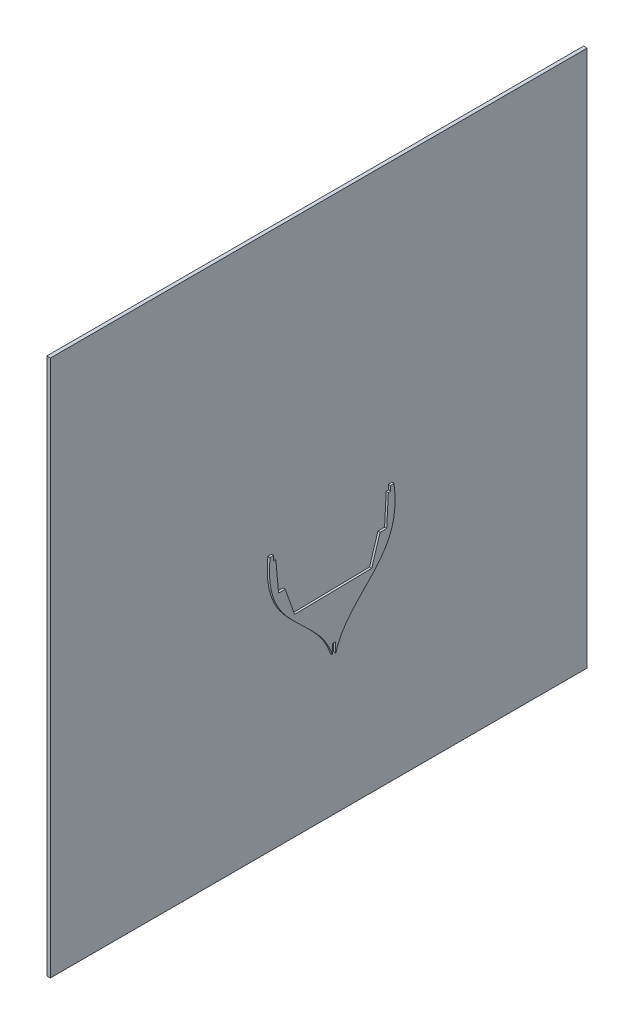
ISO-10303-21;
HEADER;
FILE_DESCRIPTION(('STEP AP214'),'2;1');
FILE_NAME('part.step','',(''),(''),'','','');
FILE_SCHEMA(('AUTOMOTIVE_DESIGN { 1 0 10303 214 1 1 1 1 }'));
ENDSEC;
DATA;
#1=APPLICATION_CONTEXT('core data for automotive mechanical design processes');
#2=APPLICATION_PROTOCOL_DEFINITION('international standard','automotive_design',2000,#1);
#3=PRODUCT_CONTEXT('',#1,'mechanical');
#4=PRODUCT('Part','Part','',(#3));
#5=PRODUCT_RELATED_PRODUCT_CATEGORY('part','',(#4));
#6=PRODUCT_DEFINITION_FORMATION('','',#4);
#7=PRODUCT_DEFINITION_CONTEXT('part definition',#1,'design');
#8=PRODUCT_DEFINITION('design','',#6,#7);
#9=PRODUCT_DEFINITION_SHAPE('','',#8);
#10=(LENGTH_UNIT() NAMED_UNIT(*) SI_UNIT(.MILLI.,.METRE.));
#11=(NAMED_UNIT(*) PLANE_ANGLE_UNIT() SI_UNIT($,.RADIAN.));
#12=(NAMED_UNIT(*) SI_UNIT($,.STERADIAN.) SOLID_ANGLE_UNIT());
#13=UNCERTAINTY_MEASURE_WITH_UNIT(LENGTH_MEASURE(1.E-05),#10,'distance_accuracy_value','');
#14=(GEOMETRIC_REPRESENTATION_CONTEXT(3) GLOBAL_UNCERTAINTY_ASSIGNED_CONTEXT((#13)) GLOBAL_UNIT_ASSIGNED_CONTEXT((#10,
#11,#12)) REPRESENTATION_CONTEXT('',''));
#15=CARTESIAN_POINT('',(0.,0.,0.));
#16=DIRECTION('',(0.,0.,1.));
#17=DIRECTION('',(1.,0.,0.));
#18=AXIS2_PLACEMENT_3D('',#15,#16,#17);
#19=CARTESIAN_POINT('',(6.,347.676833701413,179.565943675881));
#20=CARTESIAN_POINT('',(6.,132.75725474235,200.919075611293));
#21=CARTESIAN_POINT('',(6.,163.447551844755,30.0334903217819));
#22=CARTESIAN_POINT('',(6.,24.8349411051071,0.449894327244288));
#23=CARTESIAN_POINT('',(6.,0.,0.));
#24=B_SPLINE_CURVE_WITH_KNOTS('',4,(#19,#20,#21,#22,#23),.UNSPECIFIED.,.F.,.F.,(5,5),(0.,1.),.UNSPECIFIED.);
#25=DIRECTION('',(-1.,0.,0.));
#26=VECTOR('',#25,1.);
#27=SURFACE_OF_LINEAR_EXTRUSION('',#24,#26);
#28=CARTESIAN_POINT('',(0.,347.676833701413,179.565943675881));
#29=CARTESIAN_POINT('',(0.,132.75725474235,200.919075611293));
#30=CARTESIAN_POINT('',(0.,163.447551844755,30.0334903217819));
#31=CARTESIAN_POINT('',(0.,24.8349411051071,0.449894327244288));
#32=CARTESIAN_POINT('',(0.,0.,0.));
#33=B_SPLINE_CURVE_WITH_KNOTS('',4,(#28,#29,#30,#31,#32),.UNSPECIFIED.,.F.,.F.,(5,5),(0.,1.),.UNSPECIFIED.);
#34=CARTESIAN_POINT('',(0.,347.676833701413,179.565943675881));
#35=VERTEX_POINT('',#34);
#36=CARTESIAN_POINT('',(0.,25.1444972537399,4.95697880467764));
#37=VERTEX_POINT('',#36);
#38=EDGE_CURVE('E191',#35,#37,#33,.T.);
#39=ORIENTED_EDGE('',*,*,#38,.T.);
#40=DIRECTION('',(1.,0.,0.));
#41=VECTOR('',#40,1.);
#42=CARTESIAN_POINT('',(0.,25.1444972537399,4.95697880467764));
#43=LINE('',#42,#41);
#44=CARTESIAN_POINT('',(6.,25.1444972537399,4.95697880467764));
#45=VERTEX_POINT('',#44);
#46=EDGE_CURVE('E197',#37,#45,#43,.T.);
#47=ORIENTED_EDGE('',*,*,#46,.T.);
#48=CARTESIAN_POINT('',(6.,347.676833701413,179.565943675881));
#49=VERTEX_POINT('',#48);
#50=EDGE_CURVE('E231',#49,#45,#24,.T.);
#51=ORIENTED_EDGE('',*,*,#50,.F.);
#52=DIRECTION('',(-1.,0.,0.));
#53=VECTOR('',#52,1.);
#54=CARTESIAN_POINT('',(6.,347.676833701413,179.565943675881));
#55=LINE('',#54,#53);
#56=EDGE_CURVE('E187',#49,#35,#55,.T.);
#57=ORIENTED_EDGE('',*,*,#56,.T.);
#58=EDGE_LOOP('',(#39,#47,#51,#57));
#59=FACE_BOUND('',#58,.T.);
#60=ADVANCED_FACE('F45',(#59),#27,.F.);
#61=CARTESIAN_POINT('',(6.,0.,0.));
#62=CARTESIAN_POINT('',(6.,24.8349411051071,0.449894327244202));
#63=CARTESIAN_POINT('',(6.,164.428089929039,-24.0938993780662));
#64=CARTESIAN_POINT('',(6.,139.947211869968,-195.978931319273));
#65=CARTESIAN_POINT('',(6.,353.952391842304,-166.855665561471));
#66=B_SPLINE_CURVE_WITH_KNOTS('',4,(#61,#62,#63,#64,#65),.UNSPECIFIED.,.F.,.F.,(5,5),(0.,1.),.UNSPECIFIED.);
#67=DIRECTION('',(-1.,0.,0.));
#68=VECTOR('',#67,1.);
#69=SURFACE_OF_LINEAR_EXTRUSION('',#66,#68);
#70=CARTESIAN_POINT('',(6.,25.307535649042,-4.04302119532236));
#71=VERTEX_POINT('',#70);
#72=CARTESIAN_POINT('',(6.,353.952391842304,-166.855665561471));
#73=VERTEX_POINT('',#72);
#74=EDGE_CURVE('E128',#71,#73,#66,.T.);
#75=ORIENTED_EDGE('',*,*,#74,.F.);
#76=DIRECTION('',(1.,0.,0.));
#77=VECTOR('',#76,1.);
#78=CARTESIAN_POINT('',(0.,25.307535649042,-4.04302119532236));
#79=LINE('',#78,#77);
#80=CARTESIAN_POINT('',(0.,25.307535649042,-4.04302119532236));
#81=VERTEX_POINT('',#80);
#82=EDGE_CURVE('E323',#81,#71,#79,.T.);
#83=ORIENTED_EDGE('',*,*,#82,.F.);
#84=CARTESIAN_POINT('',(0.,0.,0.));
#85=CARTESIAN_POINT('',(0.,24.8349411051071,0.449894327244202));
#86=CARTESIAN_POINT('',(0.,164.428089929039,-24.0938993780662));
#87=CARTESIAN_POINT('',(0.,139.947211869968,-195.978931319273));
#88=CARTESIAN_POINT('',(0.,353.952391842304,-166.855665561471));
#89=B_SPLINE_CURVE_WITH_KNOTS('',4,(#84,#85,#86,#87,#88),.UNSPECIFIED.,.F.,.F.,(5,5),(0.,1.),.UNSPECIFIED.);
#90=CARTESIAN_POINT('',(0.,353.952391842304,-166.855665561471));
#91=VERTEX_POINT('',#90);
#92=EDGE_CURVE('E196',#81,#91,#89,.T.);
#93=ORIENTED_EDGE('',*,*,#92,.T.);
#94=DIRECTION('',(-1.,0.,0.));
#95=VECTOR('',#94,1.);
#96=CARTESIAN_POINT('',(6.,353.952391842304,-166.855665561471));
#97=LINE('',#96,#95);
#98=EDGE_CURVE('E13',#73,#91,#97,.T.);
#99=ORIENTED_EDGE('',*,*,#98,.F.);
#100=EDGE_LOOP('',(#75,#83,#93,#99));
#101=FACE_BOUND('',#100,.T.);
#102=ADVANCED_FACE('F335',(#101),#69,.F.);
#103=CARTESIAN_POINT('',(6.,353.952391842304,-166.855665561471));
#104=DIRECTION('',(0.,-0.999835956927465,-0.0181124055536444));
#105=DIRECTION('',(0.,0.0181124055536444,-0.999835956927465));
#106=AXIS2_PLACEMENT_3D('',#103,#104,#105);
#107=PLANE('',#106);
#108=DIRECTION('',(0.,-0.0181124055536444,0.999835956927465));
#109=VECTOR('',#108,1.);
#110=CARTESIAN_POINT('',(0.,353.952391842304,-166.855665561471));
#111=LINE('',#110,#109);
#112=CARTESIAN_POINT('',(0.,353.771238069747,-156.855665561471));
#113=VERTEX_POINT('',#112);
#114=EDGE_CURVE('E204',#91,#113,#111,.T.);
#115=ORIENTED_EDGE('',*,*,#114,.T.);
#116=DIRECTION('',(-1.,0.,0.));
#117=VECTOR('',#116,1.);
#118=CARTESIAN_POINT('',(6.,353.771238069747,-156.855665561471));
#119=LINE('',#118,#117);
#120=CARTESIAN_POINT('',(6.,353.771238069747,-156.855665561471));
#121=VERTEX_POINT('',#120);
#122=EDGE_CURVE('E53',#121,#113,#119,.T.);
#123=ORIENTED_EDGE('',*,*,#122,.F.);
#124=DIRECTION('',(0.,-0.0181124055536444,0.999835956927465));
#125=VECTOR('',#124,1.);
#126=CARTESIAN_POINT('',(6.,353.952391842304,-166.855665561471));
#127=LINE('',#126,#125);
#128=EDGE_CURVE('E317',#73,#121,#127,.T.);
#129=ORIENTED_EDGE('',*,*,#128,.F.);
#130=ORIENTED_EDGE('',*,*,#98,.T.);
#131=EDGE_LOOP('',(#115,#123,#129,#130));
#132=FACE_BOUND('',#131,.T.);
#133=ADVANCED_FACE('F338',(#132),#107,.F.);
#134=CARTESIAN_POINT('',(6.,353.771238069747,-156.855665561471));
#135=DIRECTION('',(0.,0.0615422827320698,-0.998104477214748));
#136=DIRECTION('',(0.,0.998104477214748,0.0615422827320698));
#137=AXIS2_PLACEMENT_3D('',#134,#135,#136);
#138=PLANE('',#137);
#139=DIRECTION('',(0.,-0.998104477214748,-0.0615422827320698));
#140=VECTOR('',#139,1.);
#141=CARTESIAN_POINT('',(0.,353.771238069747,-156.855665561471));
#142=LINE('',#141,#140);
#143=CARTESIAN_POINT('',(0.,339.701693596399,-157.723181842238));
#144=VERTEX_POINT('',#143);
#145=EDGE_CURVE('E209',#113,#144,#142,.T.);
#146=ORIENTED_EDGE('',*,*,#145,.T.);
#147=DIRECTION('',(-1.,0.,0.));
#148=VECTOR('',#147,1.);
#149=CARTESIAN_POINT('',(6.,339.701693596399,-157.723181842238));
#150=LINE('',#149,#148);
#151=CARTESIAN_POINT('',(6.,339.701693596399,-157.723181842238));
#152=VERTEX_POINT('',#151);
#153=EDGE_CURVE('E256',#152,#144,#150,.T.);
#154=ORIENTED_EDGE('',*,*,#153,.F.);
#155=DIRECTION('',(0.,-0.998104477214748,-0.0615422827320698));
#156=VECTOR('',#155,1.);
#157=CARTESIAN_POINT('',(6.,353.771238069747,-156.855665561471));
#158=LINE('',#157,#156);
#159=EDGE_CURVE('E265',#121,#152,#158,.T.);
#160=ORIENTED_EDGE('',*,*,#159,.F.);
#161=ORIENTED_EDGE('',*,*,#122,.T.);
#162=EDGE_LOOP('',(#146,#154,#160,#161));
#163=FACE_BOUND('',#162,.T.);
#164=ADVANCED_FACE('F263',(#163),#138,.F.);
#165=CARTESIAN_POINT('',(6.,339.701693596399,-157.723181842238));
#166=DIRECTION('',(0.,-0.999835956927465,-0.0181124055536607));
#167=DIRECTION('',(0.,0.0181124055536607,-0.999835956927465));
#168=AXIS2_PLACEMENT_3D('',#165,#166,#167);
#169=PLANE('',#168);
#170=DIRECTION('',(0.,-0.0181124055536607,0.999835956927465));
#171=VECTOR('',#170,1.);
#172=CARTESIAN_POINT('',(0.,339.701693596399,-157.723181842238));
#173=LINE('',#172,#171);
#174=CARTESIAN_POINT('',(0.,339.580236130428,-151.018520699586));
#175=VERTEX_POINT('',#174);
#176=EDGE_CURVE('E211',#144,#175,#173,.T.);
#177=ORIENTED_EDGE('',*,*,#176,.T.);
#178=DIRECTION('',(-1.,0.,0.));
#179=VECTOR('',#178,1.);
#180=CARTESIAN_POINT('',(6.,339.580236130428,-151.018520699586));
#181=LINE('',#180,#179);
#182=CARTESIAN_POINT('',(6.,339.580236130428,-151.018520699586));
#183=VERTEX_POINT('',#182);
#184=EDGE_CURVE('E253',#183,#175,#181,.T.);
#185=ORIENTED_EDGE('',*,*,#184,.F.);
#186=DIRECTION('',(0.,-0.0181124055536607,0.999835956927465));
#187=VECTOR('',#186,1.);
#188=CARTESIAN_POINT('',(6.,339.701693596399,-157.723181842238));
#189=LINE('',#188,#187);
#190=EDGE_CURVE('E287',#152,#183,#189,.T.);
#191=ORIENTED_EDGE('',*,*,#190,.F.);
#192=ORIENTED_EDGE('',*,*,#153,.T.);
#193=EDGE_LOOP('',(#177,#185,#191,#192));
#194=FACE_BOUND('',#193,.T.);
#195=ADVANCED_FACE('F278',(#194),#169,.F.);
#196=CARTESIAN_POINT('',(6.,339.580236130428,-151.018520699586));
#197=DIRECTION('',(0.,-0.0538390916893999,-0.998549624308207));
#198=DIRECTION('',(0.,0.998549624308207,-0.0538390916893999));
#199=AXIS2_PLACEMENT_3D('',#196,#197,#198);
#200=PLANE('',#199);
#201=DIRECTION('',(0.,-0.998549624308206,0.0538390916893999));
#202=VECTOR('',#201,1.);
#203=CARTESIAN_POINT('',(0.,339.580236130428,-151.018520699586));
#204=LINE('',#203,#202);
#205=CARTESIAN_POINT('',(0.,255.274664597182,-146.47299258039));
#206=VERTEX_POINT('',#205);
#207=EDGE_CURVE('E213',#175,#206,#204,.T.);
#208=ORIENTED_EDGE('',*,*,#207,.T.);
#209=DIRECTION('',(-1.,0.,0.));
#210=VECTOR('',#209,1.);
#211=CARTESIAN_POINT('',(6.,255.274664597182,-146.47299258039));
#212=LINE('',#211,#210);
#213=CARTESIAN_POINT('',(6.,255.274664597182,-146.47299258039));
#214=VERTEX_POINT('',#213);
#215=EDGE_CURVE('E250',#214,#206,#212,.T.);
#216=ORIENTED_EDGE('',*,*,#215,.F.);
#217=DIRECTION('',(0.,-0.998549624308206,0.0538390916893999));
#218=VECTOR('',#217,1.);
#219=CARTESIAN_POINT('',(6.,339.580236130428,-151.018520699586));
#220=LINE('',#219,#218);
#221=EDGE_CURVE('E284',#183,#214,#220,.T.);
#222=ORIENTED_EDGE('',*,*,#221,.F.);
#223=ORIENTED_EDGE('',*,*,#184,.T.);
#224=EDGE_LOOP('',(#208,#216,#222,#223));
#225=FACE_BOUND('',#224,.T.);
#226=ADVANCED_FACE('F282',(#225),#200,.F.);
#227=CARTESIAN_POINT('',(6.,255.274664597182,-146.47299258039));
#228=DIRECTION('',(0.,-0.999835956927465,-0.0181124055536453));
#229=DIRECTION('',(0.,0.0181124055536453,-0.999835956927465));
#230=AXIS2_PLACEMENT_3D('',#227,#228,#229);
#231=PLANE('',#230);
#232=DIRECTION('',(0.,-0.0181124055536454,0.999835956927465));
#233=VECTOR('',#232,1.);
#234=CARTESIAN_POINT('',(0.,255.274664597182,-146.47299258039));
#235=LINE('',#234,#233);
#236=CARTESIAN_POINT('',(0.,254.939924048743,-127.994738238122));
#237=VERTEX_POINT('',#236);
#238=EDGE_CURVE('E215',#206,#237,#235,.T.);
#239=ORIENTED_EDGE('',*,*,#238,.T.);
#240=DIRECTION('',(-1.,0.,0.));
#241=VECTOR('',#240,1.);
#242=CARTESIAN_POINT('',(6.,254.939924048743,-127.994738238122));
#243=LINE('',#242,#241);
#244=CARTESIAN_POINT('',(6.,254.939924048743,-127.994738238122));
#245=VERTEX_POINT('',#244);
#246=EDGE_CURVE('E247',#245,#237,#243,.T.);
#247=ORIENTED_EDGE('',*,*,#246,.F.);
#248=DIRECTION('',(0.,-0.0181124055536454,0.999835956927465));
#249=VECTOR('',#248,1.);
#250=CARTESIAN_POINT('',(6.,255.274664597182,-146.47299258039));
#251=LINE('',#250,#249);
#252=EDGE_CURVE('E286',#214,#245,#251,.T.);
#253=ORIENTED_EDGE('',*,*,#252,.F.);
#254=ORIENTED_EDGE('',*,*,#215,.T.);
#255=EDGE_LOOP('',(#239,#247,#253,#254));
#256=FACE_BOUND('',#255,.T.);
#257=ADVANCED_FACE('F348',(#256),#231,.F.);
#258=CARTESIAN_POINT('',(6.,254.939924048743,-127.994738238122));
#259=DIRECTION('',(0.,-0.299079840367612,-0.954228090702471));
#260=DIRECTION('',(0.,0.954228090702471,-0.299079840367612));
#261=AXIS2_PLACEMENT_3D('',#258,#259,#260);
#262=PLANE('',#261);
#263=DIRECTION('',(0.,-0.954228090702471,0.299079840367612));
#264=VECTOR('',#263,1.);
#265=CARTESIAN_POINT('',(0.,254.939924048743,-127.994738238122));
#266=LINE('',#265,#264);
#267=CARTESIAN_POINT('',(0.,179.749987818233,-104.428261476243));
#268=VERTEX_POINT('',#267);
#269=EDGE_CURVE('E217',#237,#268,#266,.T.);
#270=ORIENTED_EDGE('',*,*,#269,.T.);
#271=DIRECTION('',(-1.,0.,0.));
#272=VECTOR('',#271,1.);
#273=CARTESIAN_POINT('',(6.,179.749987818233,-104.428261476243));
#274=LINE('',#273,#272);
#275=CARTESIAN_POINT('',(6.,179.749987818233,-104.428261476243));
#276=VERTEX_POINT('',#275);
#277=EDGE_CURVE('E244',#276,#268,#274,.T.);
#278=ORIENTED_EDGE('',*,*,#277,.F.);
#279=DIRECTION('',(0.,-0.954228090702471,0.299079840367612));
#280=VECTOR('',#279,1.);
#281=CARTESIAN_POINT('',(6.,254.939924048743,-127.994738238122));
#282=LINE('',#281,#280);
#283=EDGE_CURVE('E289',#245,#276,#282,.T.);
#284=ORIENTED_EDGE('',*,*,#283,.F.);
#285=ORIENTED_EDGE('',*,*,#246,.T.);
#286=EDGE_LOOP('',(#270,#278,#284,#285));
#287=FACE_BOUND('',#286,.T.);
#288=ADVANCED_FACE('F351',(#287),#262,.F.);
#289=CARTESIAN_POINT('',(6.,179.749987818233,-104.428261476243));
#290=DIRECTION('',(0.,-0.999835956927465,-0.0181124055536428));
#291=DIRECTION('',(0.,0.0181124055536428,-0.999835956927466));
#292=AXIS2_PLACEMENT_3D('',#289,#290,#291);
#293=PLANE('',#292);
#294=DIRECTION('',(0.,-0.0181124055536428,0.999835956927465));
#295=VECTOR('',#294,1.);
#296=CARTESIAN_POINT('',(0.,179.749987818233,-104.428261476243));
#297=LINE('',#296,#295);
#298=CARTESIAN_POINT('',(0.,175.849777042588,110.870085368766));
#299=VERTEX_POINT('',#298);
#300=EDGE_CURVE('E219',#268,#299,#297,.T.);
#301=ORIENTED_EDGE('',*,*,#300,.T.);
#302=DIRECTION('',(-1.,0.,0.));
#303=VECTOR('',#302,1.);
#304=CARTESIAN_POINT('',(6.,175.849777042588,110.870085368766));
#305=LINE('',#304,#303);
#306=CARTESIAN_POINT('',(6.,175.849777042588,110.870085368766));
#307=VERTEX_POINT('',#306);
#308=EDGE_CURVE('E241',#307,#299,#305,.T.);
#309=ORIENTED_EDGE('',*,*,#308,.F.);
#310=DIRECTION('',(0.,-0.0181124055536428,0.999835956927465));
#311=VECTOR('',#310,1.);
#312=CARTESIAN_POINT('',(6.,179.749987818233,-104.428261476243));
#313=LINE('',#312,#311);
#314=EDGE_CURVE('E295',#276,#307,#313,.T.);
#315=ORIENTED_EDGE('',*,*,#314,.F.);
#316=ORIENTED_EDGE('',*,*,#277,.T.);
#317=EDGE_LOOP('',(#301,#309,#315,#316));
#318=FACE_BOUND('',#317,.T.);
#319=ADVANCED_FACE('F355',(#318),#293,.F.);
#320=CARTESIAN_POINT('',(6.,250.136828640148,137.14439415621));
#321=DIRECTION('',(0.,-0.333444670466363,0.94276967056518));
#322=DIRECTION('',(0.,-0.94276967056518,-0.333444670466363));
#323=AXIS2_PLACEMENT_3D('',#320,#321,#322);
#324=PLANE('',#323);
#325=DIRECTION('',(0.,0.94276967056518,0.333444670466363));
#326=VECTOR('',#325,1.);
#327=CARTESIAN_POINT('',(0.,250.136828640148,137.14439415621));
#328=LINE('',#327,#326);
#329=CARTESIAN_POINT('',(0.,250.136828640148,137.14439415621));
#330=VERTEX_POINT('',#329);
#331=EDGE_CURVE('E221',#299,#330,#328,.T.);
#332=ORIENTED_EDGE('',*,*,#331,.T.);
#333=DIRECTION('',(-1.,0.,0.));
#334=VECTOR('',#333,1.);
#335=CARTESIAN_POINT('',(6.,250.136828640148,137.14439415621));
#336=LINE('',#335,#334);
#337=CARTESIAN_POINT('',(6.,250.136828640148,137.14439415621));
#338=VERTEX_POINT('',#337);
#339=EDGE_CURVE('E238',#338,#330,#336,.T.);
#340=ORIENTED_EDGE('',*,*,#339,.F.);
#341=DIRECTION('',(0.,0.94276967056518,0.333444670466363));
#342=VECTOR('',#341,1.);
#343=CARTESIAN_POINT('',(6.,250.136828640148,137.14439415621));
#344=LINE('',#343,#342);
#345=EDGE_CURVE('E297',#307,#338,#344,.T.);
#346=ORIENTED_EDGE('',*,*,#345,.F.);
#347=ORIENTED_EDGE('',*,*,#308,.T.);
#348=EDGE_LOOP('',(#332,#340,#346,#347));
#349=FACE_BOUND('',#348,.T.);
#350=ADVANCED_FACE('F359',(#349),#324,.F.);
#351=CARTESIAN_POINT('',(6.,249.802088091709,155.622648498477));
#352=DIRECTION('',(0.,-0.999835956927465,-0.0181124055536441));
#353=DIRECTION('',(0.,0.0181124055536441,-0.999835956927465));
#354=AXIS2_PLACEMENT_3D('',#351,#352,#353);
#355=PLANE('',#354);
#356=DIRECTION('',(0.,-0.0181124055536441,0.999835956927465));
#357=VECTOR('',#356,1.);
#358=CARTESIAN_POINT('',(0.,249.802088091709,155.622648498477));
#359=LINE('',#358,#357);
#360=CARTESIAN_POINT('',(0.,249.802088091709,155.622648498477));
#361=VERTEX_POINT('',#360);
#362=EDGE_CURVE('E223',#330,#361,#359,.T.);
#363=ORIENTED_EDGE('',*,*,#362,.T.);
#364=DIRECTION('',(-1.,0.,0.));
#365=VECTOR('',#364,1.);
#366=CARTESIAN_POINT('',(6.,249.802088091709,155.622648498477));
#367=LINE('',#366,#365);
#368=CARTESIAN_POINT('',(6.,249.802088091709,155.622648498477));
#369=VERTEX_POINT('',#368);
#370=EDGE_CURVE('E235',#369,#361,#367,.T.);
#371=ORIENTED_EDGE('',*,*,#370,.F.);
#372=DIRECTION('',(0.,-0.0181124055536441,0.999835956927465));
#373=VECTOR('',#372,1.);
#374=CARTESIAN_POINT('',(6.,249.802088091709,155.622648498477));
#375=LINE('',#374,#373);
#376=EDGE_CURVE('E299',#338,#369,#375,.T.);
#377=ORIENTED_EDGE('',*,*,#376,.F.);
#378=ORIENTED_EDGE('',*,*,#339,.T.);
#379=EDGE_LOOP('',(#363,#371,#377,#378));
#380=FACE_BOUND('',#379,.T.);
#381=ADVANCED_FACE('F305',(#380),#355,.F.);
#382=CARTESIAN_POINT('',(6.,333.887711296337,163.218646636903));
#383=DIRECTION('',(0.,-0.0899701045781973,0.995944466464967));
#384=DIRECTION('',(0.,-0.995944466464967,-0.0899701045781973));
#385=AXIS2_PLACEMENT_3D('',#382,#383,#384);
#386=PLANE('',#385);
#387=DIRECTION('',(0.,0.995944466464967,0.0899701045781973));
#388=VECTOR('',#387,1.);
#389=CARTESIAN_POINT('',(0.,333.887711296337,163.218646636903));
#390=LINE('',#389,#388);
#391=CARTESIAN_POINT('',(0.,333.887711296337,163.218646636903));
#392=VERTEX_POINT('',#391);
#393=EDGE_CURVE('E225',#361,#392,#390,.T.);
#394=ORIENTED_EDGE('',*,*,#393,.T.);
#395=DIRECTION('',(-1.,0.,0.));
#396=VECTOR('',#395,1.);
#397=CARTESIAN_POINT('',(6.,333.887711296337,163.218646636903));
#398=LINE('',#397,#396);
#399=CARTESIAN_POINT('',(6.,333.887711296337,163.218646636903));
#400=VERTEX_POINT('',#399);
#401=EDGE_CURVE('E182',#400,#392,#398,.T.);
#402=ORIENTED_EDGE('',*,*,#401,.F.);
#403=DIRECTION('',(0.,0.995944466464967,0.0899701045781973));
#404=VECTOR('',#403,1.);
#405=CARTESIAN_POINT('',(6.,333.887711296337,163.218646636903));
#406=LINE('',#405,#404);
#407=EDGE_CURVE('E170',#369,#400,#406,.T.);
#408=ORIENTED_EDGE('',*,*,#407,.F.);
#409=ORIENTED_EDGE('',*,*,#370,.T.);
#410=EDGE_LOOP('',(#394,#402,#408,#409));
#411=FACE_BOUND('',#410,.T.);
#412=ADVANCED_FACE('F309',(#411),#386,.F.);
#413=CARTESIAN_POINT('',(6.,333.766253830366,169.923307779555));
#414=DIRECTION('',(0.,-0.999835956927465,-0.0181124055536439));
#415=DIRECTION('',(0.,0.0181124055536439,-0.999835956927466));
#416=AXIS2_PLACEMENT_3D('',#413,#414,#415);
#417=PLANE('',#416);
#418=DIRECTION('',(0.,-0.0181124055536439,0.999835956927465));
#419=VECTOR('',#418,1.);
#420=CARTESIAN_POINT('',(0.,333.766253830366,169.923307779555));
#421=LINE('',#420,#419);
#422=CARTESIAN_POINT('',(0.,333.766253830366,169.923307779555));
#423=VERTEX_POINT('',#422);
#424=EDGE_CURVE('E179',#392,#423,#421,.T.);
#425=ORIENTED_EDGE('',*,*,#424,.T.);
#426=DIRECTION('',(-1.,0.,0.));
#427=VECTOR('',#426,1.);
#428=CARTESIAN_POINT('',(6.,333.766253830366,169.923307779555));
#429=LINE('',#428,#427);
#430=CARTESIAN_POINT('',(6.,333.766253830366,169.923307779555));
#431=VERTEX_POINT('',#430);
#432=EDGE_CURVE('E176',#431,#423,#429,.T.);
#433=ORIENTED_EDGE('',*,*,#432,.F.);
#434=DIRECTION('',(0.,-0.0181124055536439,0.999835956927465));
#435=VECTOR('',#434,1.);
#436=CARTESIAN_POINT('',(6.,333.766253830366,169.923307779555));
#437=LINE('',#436,#435);
#438=EDGE_CURVE('E163',#400,#431,#437,.T.);
#439=ORIENTED_EDGE('',*,*,#438,.F.);
#440=ORIENTED_EDGE('',*,*,#401,.T.);
#441=EDGE_LOOP('',(#425,#433,#439,#440));
#442=FACE_BOUND('',#441,.T.);
#443=ADVANCED_FACE('F177',(#442),#417,.F.);
#444=CARTESIAN_POINT('',(6.,347.857987473971,169.565943675881));
#445=DIRECTION('',(0.,0.0253516887165552,0.999678594288794));
#446=DIRECTION('',(0.,-0.999678594288794,0.0253516887165552));
#447=AXIS2_PLACEMENT_3D('',#444,#445,#446);
#448=PLANE('',#447);
#449=DIRECTION('',(0.,0.999678594288794,-0.0253516887165552));
#450=VECTOR('',#449,1.);
#451=CARTESIAN_POINT('',(0.,347.857987473971,169.565943675881));
#452=LINE('',#451,#450);
#453=CARTESIAN_POINT('',(0.,347.857987473971,169.565943675881));
#454=VERTEX_POINT('',#453);
#455=EDGE_CURVE('E228',#423,#454,#452,.T.);
#456=ORIENTED_EDGE('',*,*,#455,.T.);
#457=DIRECTION('',(-1.,0.,0.));
#458=VECTOR('',#457,1.);
#459=CARTESIAN_POINT('',(6.,347.857987473971,169.565943675881));
#460=LINE('',#459,#458);
#461=CARTESIAN_POINT('',(6.,347.857987473971,169.565943675881));
#462=VERTEX_POINT('',#461);
#463=EDGE_CURVE('E183',#462,#454,#460,.T.);
#464=ORIENTED_EDGE('',*,*,#463,.F.);
#465=DIRECTION('',(0.,0.999678594288794,-0.0253516887165552));
#466=VECTOR('',#465,1.);
#467=CARTESIAN_POINT('',(6.,347.857987473971,169.565943675881));
#468=LINE('',#467,#466);
#469=EDGE_CURVE('E167',#431,#462,#468,.T.);
#470=ORIENTED_EDGE('',*,*,#469,.F.);
#471=ORIENTED_EDGE('',*,*,#432,.T.);
#472=EDGE_LOOP('',(#456,#464,#470,#471));
#473=FACE_BOUND('',#472,.T.);
#474=ADVANCED_FACE('F185',(#473),#448,.F.);
#475=CARTESIAN_POINT('',(6.,347.676833701413,179.565943675881));
#476=DIRECTION('',(0.,-0.999835956927465,-0.0181124055536503));
#477=DIRECTION('',(0.,0.0181124055536503,-0.999835956927465));
#478=AXIS2_PLACEMENT_3D('',#475,#476,#477);
#479=PLANE('',#478);
#480=DIRECTION('',(0.,-0.0181124055536503,0.999835956927465));
#481=VECTOR('',#480,1.);
#482=CARTESIAN_POINT('',(0.,347.676833701413,179.565943675881));
#483=LINE('',#482,#481);
#484=EDGE_CURVE('E120',#454,#35,#483,.T.);
#485=ORIENTED_EDGE('',*,*,#484,.T.);
#486=ORIENTED_EDGE('',*,*,#56,.F.);
#487=DIRECTION('',(0.,-0.0181124055536503,0.999835956927465));
#488=VECTOR('',#487,1.);
#489=CARTESIAN_POINT('',(6.,347.676833701413,179.565943675881));
#490=LINE('',#489,#488);
#491=EDGE_CURVE('E69',#462,#49,#490,.T.);
#492=ORIENTED_EDGE('',*,*,#491,.F.);
#493=ORIENTED_EDGE('',*,*,#463,.T.);
#494=EDGE_LOOP('',(#485,#486,#492,#493));
#495=FACE_BOUND('',#494,.T.);
#496=ADVANCED_FACE('F311',(#495),#479,.F.);
#497=CARTESIAN_POINT('',(6.,122.420683009986,72.8276728350451));
#498=DIRECTION('',(-1.,0.,0.));
#499=DIRECTION('',(0.,0.,1.));
#500=AXIS2_PLACEMENT_3D('',#497,#498,#499);
#501=PLANE('',#500);
#502=ORIENTED_EDGE('',*,*,#50,.T.);
#503=DIRECTION('',(0.,-0.999835956927465,-0.0181124055536429));
#504=VECTOR('',#503,1.);
#505=CARTESIAN_POINT('',(6.,25.1444972537399,4.95697880467764));
#506=LINE('',#505,#504);
#507=CARTESIAN_POINT('',(6.,52.1444972537399,5.44609399058391));
#508=VERTEX_POINT('',#507);
#509=EDGE_CURVE('E511',#508,#45,#506,.T.);
#510=ORIENTED_EDGE('',*,*,#509,.F.);
#511=DIRECTION('',(0.,-0.0181124055536438,0.999835956927465));
#512=VECTOR('',#511,1.);
#513=CARTESIAN_POINT('',(6.,52.1444972537399,5.44609399058391));
#514=LINE('',#513,#512);
#515=CARTESIAN_POINT('',(6.,52.307535649042,-3.55390600941609));
#516=VERTEX_POINT('',#515);
#517=EDGE_CURVE('E519',#516,#508,#514,.T.);
#518=ORIENTED_EDGE('',*,*,#517,.F.);
#519=DIRECTION('',(0.,0.999835956927465,0.0181124055536428));
#520=VECTOR('',#519,1.);
#521=CARTESIAN_POINT('',(6.,52.307535649042,-3.55390600941609));
#522=LINE('',#521,#520);
#523=EDGE_CURVE('E523',#71,#516,#522,.T.);
#524=ORIENTED_EDGE('',*,*,#523,.F.);
#525=ORIENTED_EDGE('',*,*,#74,.T.);
#526=ORIENTED_EDGE('',*,*,#128,.T.);
#527=ORIENTED_EDGE('',*,*,#159,.T.);
#528=ORIENTED_EDGE('',*,*,#190,.T.);
#529=ORIENTED_EDGE('',*,*,#221,.T.);
#530=ORIENTED_EDGE('',*,*,#252,.T.);
#531=ORIENTED_EDGE('',*,*,#283,.T.);
#532=ORIENTED_EDGE('',*,*,#314,.T.);
#533=ORIENTED_EDGE('',*,*,#345,.T.);
#534=ORIENTED_EDGE('',*,*,#376,.T.);
#535=ORIENTED_EDGE('',*,*,#407,.T.);
#536=ORIENTED_EDGE('',*,*,#438,.T.);
#537=ORIENTED_EDGE('',*,*,#469,.T.);
#538=ORIENTED_EDGE('',*,*,#491,.T.);
#539=EDGE_LOOP('',(#502,#510,#518,#524,#525,#526,#527,#528,#529,#530,#531,#532,#533,#534,#535,
#536,#537,#538));
#540=FACE_BOUND('',#539,.T.);
#541=ADVANCED_FACE('F165',(#540),#501,.F.);
#542=CARTESIAN_POINT('',(0.,122.420683009986,72.8276728350451));
#543=DIRECTION('',(-1.,0.,0.));
#544=DIRECTION('',(0.,0.,1.));
#545=AXIS2_PLACEMENT_3D('',#542,#543,#544);
#546=PLANE('',#545);
#547=DIRECTION('',(0.,-0.999835956927465,-0.0181124055536429));
#548=VECTOR('',#547,1.);
#549=CARTESIAN_POINT('',(0.,25.1444972537399,4.95697880467764));
#550=LINE('',#549,#548);
#551=CARTESIAN_POINT('',(0.,52.1444972537399,5.44609399058391));
#552=VERTEX_POINT('',#551);
#553=EDGE_CURVE('E532',#552,#37,#550,.T.);
#554=ORIENTED_EDGE('',*,*,#553,.T.);
#555=ORIENTED_EDGE('',*,*,#38,.F.);
#556=ORIENTED_EDGE('',*,*,#484,.F.);
#557=ORIENTED_EDGE('',*,*,#455,.F.);
#558=ORIENTED_EDGE('',*,*,#424,.F.);
#559=ORIENTED_EDGE('',*,*,#393,.F.);
#560=ORIENTED_EDGE('',*,*,#362,.F.);
#561=ORIENTED_EDGE('',*,*,#331,.F.);
#562=ORIENTED_EDGE('',*,*,#300,.F.);
#563=ORIENTED_EDGE('',*,*,#269,.F.);
#564=ORIENTED_EDGE('',*,*,#238,.F.);
#565=ORIENTED_EDGE('',*,*,#207,.F.);
#566=ORIENTED_EDGE('',*,*,#176,.F.);
#567=ORIENTED_EDGE('',*,*,#145,.F.);
#568=ORIENTED_EDGE('',*,*,#114,.F.);
#569=ORIENTED_EDGE('',*,*,#92,.F.);
#570=DIRECTION('',(0.,0.999835956927465,0.0181124055536428));
#571=VECTOR('',#570,1.);
#572=CARTESIAN_POINT('',(0.,52.307535649042,-3.55390600941609));
#573=LINE('',#572,#571);
#574=CARTESIAN_POINT('',(0.,52.307535649042,-3.55390600941607));
#575=VERTEX_POINT('',#574);
#576=EDGE_CURVE('E518',#81,#575,#573,.T.);
#577=ORIENTED_EDGE('',*,*,#576,.T.);
#578=DIRECTION('',(0.,-0.0181124055536438,0.999835956927465));
#579=VECTOR('',#578,1.);
#580=CARTESIAN_POINT('',(0.,52.1444972537399,5.44609399058391));
#581=LINE('',#580,#579);
#582=EDGE_CURVE('E60',#575,#552,#581,.T.);
#583=ORIENTED_EDGE('',*,*,#582,.T.);
#584=EDGE_LOOP('',(#554,#555,#556,#557,#558,#559,#560,#561,#562,#563,#564,#565,#566,#567,#568,
#569,#577,#583));
#585=FACE_BOUND('',#584,.T.);
#586=ADVANCED_FACE('F272',(#585),#546,.T.);
#587=CARTESIAN_POINT('',(0.,25.1444972537399,4.95697880467764));
#588=DIRECTION('',(0.,-0.0181124055536429,0.999835956927465));
#589=DIRECTION('',(0.,-0.999835956927466,-0.0181124055536429));
#590=AXIS2_PLACEMENT_3D('',#587,#588,#589);
#591=PLANE('',#590);
#592=ORIENTED_EDGE('',*,*,#509,.T.);
#593=ORIENTED_EDGE('',*,*,#46,.F.);
#594=ORIENTED_EDGE('',*,*,#553,.F.);
#595=DIRECTION('',(1.,0.,0.));
#596=VECTOR('',#595,1.);
#597=CARTESIAN_POINT('',(0.,52.1444972537399,5.44609399058391));
#598=LINE('',#597,#596);
#599=EDGE_CURVE('E514',#552,#508,#598,.T.);
#600=ORIENTED_EDGE('',*,*,#599,.T.);
#601=EDGE_LOOP('',(#592,#593,#594,#600));
#602=FACE_BOUND('',#601,.T.);
#603=ADVANCED_FACE('F376',(#602),#591,.F.);
#604=CARTESIAN_POINT('',(0.,52.1444972537399,5.44609399058391));
#605=DIRECTION('',(0.,0.999835956927465,0.0181124055536438));
#606=DIRECTION('',(0.,-0.0181124055536438,0.999835956927466));
#607=AXIS2_PLACEMENT_3D('',#604,#605,#606);
#608=PLANE('',#607);
#609=ORIENTED_EDGE('',*,*,#517,.T.);
#610=ORIENTED_EDGE('',*,*,#599,.F.);
#611=ORIENTED_EDGE('',*,*,#582,.F.);
#612=DIRECTION('',(1.,0.,0.));
#613=VECTOR('',#612,1.);
#614=CARTESIAN_POINT('',(0.,52.307535649042,-3.55390600941609));
#615=LINE('',#614,#613);
#616=EDGE_CURVE('E528',#575,#516,#615,.T.);
#617=ORIENTED_EDGE('',*,*,#616,.T.);
#618=EDGE_LOOP('',(#609,#610,#611,#617));
#619=FACE_BOUND('',#618,.T.);
#620=ADVANCED_FACE('F382',(#619),#608,.F.);
#621=CARTESIAN_POINT('',(0.,52.307535649042,-3.55390600941609));
#622=DIRECTION('',(0.,0.0181124055536428,-0.999835956927465));
#623=DIRECTION('',(0.,0.999835956927466,0.0181124055536428));
#624=AXIS2_PLACEMENT_3D('',#621,#622,#623);
#625=PLANE('',#624);
#626=ORIENTED_EDGE('',*,*,#523,.T.);
#627=ORIENTED_EDGE('',*,*,#616,.F.);
#628=ORIENTED_EDGE('',*,*,#576,.F.);
#629=ORIENTED_EDGE('',*,*,#82,.T.);
#630=EDGE_LOOP('',(#626,#627,#628,#629));
#631=FACE_BOUND('',#630,.T.);
#632=ADVANCED_FACE('F379',(#631),#625,.F.);
#633=CLOSED_SHELL('',(#60,#102,#133,#164,#195,#226,#257,#288,#319,#350,#381,#412,#443,#474,#496,
#541,#586,#603,#620,#632));
#634=MANIFOLD_SOLID_BREP('B2',#633);
#635=CARTESIAN_POINT('',(-10.,0.,0.));
#636=DIRECTION('',(-1.,0.,0.));
#637=DIRECTION('',(0.,0.,1.));
#638=AXIS2_PLACEMENT_3D('',#635,#636,#637);
#639=PLANE('',#638);
#640=DIRECTION('',(0.,0.,-1.));
#641=VECTOR('',#640,1.);
#642=CARTESIAN_POINT('',(-10.,-378.710653275796,777.274991403029));
#643=LINE('',#642,#641);
#644=CARTESIAN_POINT('',(-10.,-378.710653275796,777.274991403029));
#645=VERTEX_POINT('',#644);
#646=CARTESIAN_POINT('',(-10.,-378.710653275796,-722.725008596971));
#647=VERTEX_POINT('',#646);
#648=EDGE_CURVE('E565',#645,#647,#643,.T.);
#649=ORIENTED_EDGE('',*,*,#648,.T.);
#650=DIRECTION('',(0.,-1.,0.));
#651=VECTOR('',#650,1.);
#652=CARTESIAN_POINT('',(-10.,1121.2893467242,-722.725008596971));
#653=LINE('',#652,#651);
#654=CARTESIAN_POINT('',(-10.,1121.2893467242,-722.725008596971));
#655=VERTEX_POINT('',#654);
#656=EDGE_CURVE('E599',#655,#647,#653,.T.);
#657=ORIENTED_EDGE('',*,*,#656,.F.);
#658=DIRECTION('',(0.,0.,-1.));
#659=VECTOR('',#658,1.);
#660=CARTESIAN_POINT('',(-10.,1121.2893467242,777.274991403029));
#661=LINE('',#660,#659);
#662=CARTESIAN_POINT('',(-10.,1121.2893467242,777.274991403029));
#663=VERTEX_POINT('',#662);
#664=EDGE_CURVE('E596',#663,#655,#661,.T.);
#665=ORIENTED_EDGE('',*,*,#664,.F.);
#666=DIRECTION('',(0.,-1.,0.));
#667=VECTOR('',#666,1.);
#668=CARTESIAN_POINT('',(-10.,1121.2893467242,777.274991403029));
#669=LINE('',#668,#667);
#670=EDGE_CURVE('E593',#663,#645,#669,.T.);
#671=ORIENTED_EDGE('',*,*,#670,.T.);
#672=EDGE_LOOP('',(#649,#657,#665,#671));
#673=FACE_BOUND('',#672,.T.);
#674=ADVANCED_FACE('F556',(#673),#639,.F.);
#675=CARTESIAN_POINT('',(-20.,0.,0.));
#676=DIRECTION('',(-1.,0.,0.));
#677=DIRECTION('',(0.,0.,1.));
#678=AXIS2_PLACEMENT_3D('',#675,#676,#677);
#679=PLANE('',#678);
#680=DIRECTION('',(0.,0.,-1.));
#681=VECTOR('',#680,1.);
#682=CARTESIAN_POINT('',(-20.,-378.710653275796,777.274991403029));
#683=LINE('',#682,#681);
#684=CARTESIAN_POINT('',(-20.,-378.710653275796,777.274991403029));
#685=VERTEX_POINT('',#684);
#686=CARTESIAN_POINT('',(-20.,-378.710653275796,-722.725008596971));
#687=VERTEX_POINT('',#686);
#688=EDGE_CURVE('E43',#685,#687,#683,.T.);
#689=ORIENTED_EDGE('',*,*,#688,.F.);
#690=DIRECTION('',(0.,-1.,0.));
#691=VECTOR('',#690,1.);
#692=CARTESIAN_POINT('',(-20.,1121.2893467242,777.274991403029));
#693=LINE('',#692,#691);
#694=CARTESIAN_POINT('',(-20.,1121.2893467242,777.274991403029));
#695=VERTEX_POINT('',#694);
#696=EDGE_CURVE('E612',#695,#685,#693,.T.);
#697=ORIENTED_EDGE('',*,*,#696,.F.);
#698=DIRECTION('',(0.,0.,-1.));
#699=VECTOR('',#698,1.);
#700=CARTESIAN_POINT('',(-20.,1121.2893467242,777.274991403029));
#701=LINE('',#700,#699);
#702=CARTESIAN_POINT('',(-20.,1121.2893467242,-722.725008596971));
#703=VERTEX_POINT('',#702);
#704=EDGE_CURVE('E603',#695,#703,#701,.T.);
#705=ORIENTED_EDGE('',*,*,#704,.T.);
#706=DIRECTION('',(0.,-1.,0.));
#707=VECTOR('',#706,1.);
#708=CARTESIAN_POINT('',(-20.,1121.2893467242,-722.725008596971));
#709=LINE('',#708,#707);
#710=EDGE_CURVE('E574',#703,#687,#709,.T.);
#711=ORIENTED_EDGE('',*,*,#710,.T.);
#712=EDGE_LOOP('',(#689,#697,#705,#711));
#713=FACE_BOUND('',#712,.T.);
#714=ADVANCED_FACE('F652',(#713),#679,.T.);
#715=CARTESIAN_POINT('',(-20.,1121.2893467242,777.274991403029));
#716=DIRECTION('',(0.,0.,1.));
#717=DIRECTION('',(1.,0.,0.));
#718=AXIS2_PLACEMENT_3D('',#715,#716,#717);
#719=PLANE('',#718);
#720=ORIENTED_EDGE('',*,*,#670,.F.);
#721=DIRECTION('',(1.,0.,0.));
#722=VECTOR('',#721,1.);
#723=CARTESIAN_POINT('',(-20.,1121.2893467242,777.274991403029));
#724=LINE('',#723,#722);
#725=EDGE_CURVE('E608',#695,#663,#724,.T.);
#726=ORIENTED_EDGE('',*,*,#725,.F.);
#727=ORIENTED_EDGE('',*,*,#696,.T.);
#728=DIRECTION('',(1.,0.,0.));
#729=VECTOR('',#728,1.);
#730=CARTESIAN_POINT('',(-20.,-378.710653275796,777.274991403029));
#731=LINE('',#730,#729);
#732=EDGE_CURVE('E604',#685,#645,#731,.T.);
#733=ORIENTED_EDGE('',*,*,#732,.T.);
#734=EDGE_LOOP('',(#720,#726,#727,#733));
#735=FACE_BOUND('',#734,.T.);
#736=ADVANCED_FACE('F613',(#735),#719,.T.);
#737=CARTESIAN_POINT('',(-20.,-378.710653275796,777.274991403029));
#738=DIRECTION('',(0.,-1.,0.));
#739=DIRECTION('',(0.,0.,-1.));
#740=AXIS2_PLACEMENT_3D('',#737,#738,#739);
#741=PLANE('',#740);
#742=ORIENTED_EDGE('',*,*,#648,.F.);
#743=ORIENTED_EDGE('',*,*,#732,.F.);
#744=ORIENTED_EDGE('',*,*,#688,.T.);
#745=DIRECTION('',(1.,0.,0.));
#746=VECTOR('',#745,1.);
#747=CARTESIAN_POINT('',(-20.,-378.710653275796,-722.725008596971));
#748=LINE('',#747,#746);
#749=EDGE_CURVE('E624',#687,#647,#748,.T.);
#750=ORIENTED_EDGE('',*,*,#749,.T.);
#751=EDGE_LOOP('',(#742,#743,#744,#750));
#752=FACE_BOUND('',#751,.T.);
#753=ADVANCED_FACE('F654',(#752),#741,.T.);
#754=CARTESIAN_POINT('',(-20.,1121.2893467242,777.274991403029));
#755=DIRECTION('',(0.,-1.,0.));
#756=DIRECTION('',(0.,0.,-1.));
#757=AXIS2_PLACEMENT_3D('',#754,#755,#756);
#758=PLANE('',#757);
#759=ORIENTED_EDGE('',*,*,#664,.T.);
#760=DIRECTION('',(1.,0.,0.));
#761=VECTOR('',#760,1.);
#762=CARTESIAN_POINT('',(-20.,1121.2893467242,-722.725008596971));
#763=LINE('',#762,#761);
#764=EDGE_CURVE('E628',#703,#655,#763,.T.);
#765=ORIENTED_EDGE('',*,*,#764,.F.);
#766=ORIENTED_EDGE('',*,*,#704,.F.);
#767=ORIENTED_EDGE('',*,*,#725,.T.);
#768=EDGE_LOOP('',(#759,#765,#766,#767));
#769=FACE_BOUND('',#768,.T.);
#770=ADVANCED_FACE('F609',(#769),#758,.F.);
#771=CARTESIAN_POINT('',(-20.,1121.2893467242,-722.725008596971));
#772=DIRECTION('',(0.,0.,1.));
#773=DIRECTION('',(1.,0.,0.));
#774=AXIS2_PLACEMENT_3D('',#771,#772,#773);
#775=PLANE('',#774);
#776=ORIENTED_EDGE('',*,*,#656,.T.);
#777=ORIENTED_EDGE('',*,*,#749,.F.);
#778=ORIENTED_EDGE('',*,*,#710,.F.);
#779=ORIENTED_EDGE('',*,*,#764,.T.);
#780=EDGE_LOOP('',(#776,#777,#778,#779));
#781=FACE_BOUND('',#780,.T.);
#782=ADVANCED_FACE('F639',(#781),#775,.F.);
#783=CLOSED_SHELL('',(#674,#714,#736,#753,#770,#782));
#784=MANIFOLD_SOLID_BREP('B7_NOT_SHOWN',#783);
#785=ADVANCED_BREP_SHAPE_REPRESENTATION('',(#18,#634,#784),#14);
#786=SHAPE_DEFINITION_REPRESENTATION(#9,#785);
ENDSEC;
END-ISO-10303-21;
